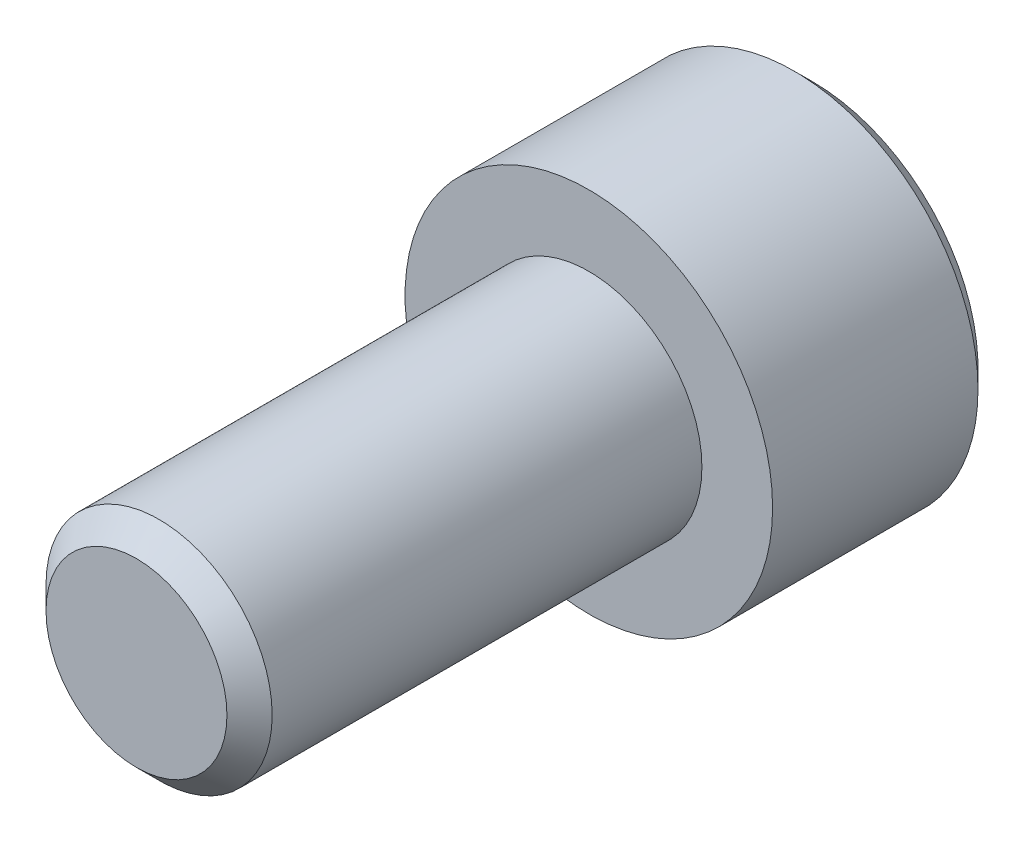
ISO-10303-21;
HEADER;
FILE_DESCRIPTION(('STEP AP214'),'2;1');
FILE_NAME('part.step','',(''),(''),'','','');
FILE_SCHEMA(('AUTOMOTIVE_DESIGN { 1 0 10303 214 1 1 1 1 }'));
ENDSEC;
DATA;
#1=APPLICATION_CONTEXT('core data for automotive mechanical design processes');
#2=APPLICATION_PROTOCOL_DEFINITION('international standard','automotive_design',2000,#1);
#3=PRODUCT_CONTEXT('',#1,'mechanical');
#4=PRODUCT('Part','Part','',(#3));
#5=PRODUCT_RELATED_PRODUCT_CATEGORY('part','',(#4));
#6=PRODUCT_DEFINITION_FORMATION('','',#4);
#7=PRODUCT_DEFINITION_CONTEXT('part definition',#1,'design');
#8=PRODUCT_DEFINITION('design','',#6,#7);
#9=PRODUCT_DEFINITION_SHAPE('','',#8);
#10=(LENGTH_UNIT() NAMED_UNIT(*) SI_UNIT(.MILLI.,.METRE.));
#11=(NAMED_UNIT(*) PLANE_ANGLE_UNIT() SI_UNIT($,.RADIAN.));
#12=(NAMED_UNIT(*) SI_UNIT($,.STERADIAN.) SOLID_ANGLE_UNIT());
#13=UNCERTAINTY_MEASURE_WITH_UNIT(LENGTH_MEASURE(1.E-05),#10,'distance_accuracy_value','');
#14=(GEOMETRIC_REPRESENTATION_CONTEXT(3) GLOBAL_UNCERTAINTY_ASSIGNED_CONTEXT((#13)) GLOBAL_UNIT_ASSIGNED_CONTEXT((#10,
#11,#12)) REPRESENTATION_CONTEXT('',''));
#15=CARTESIAN_POINT('',(0.,0.,0.));
#16=DIRECTION('',(0.,0.,1.));
#17=DIRECTION('',(1.,0.,0.));
#18=AXIS2_PLACEMENT_3D('',#15,#16,#17);
#19=CARTESIAN_POINT('',(0.,0.,-4.25));
#20=DIRECTION('',(0.,0.,1.));
#21=DIRECTION('',(1.,0.,0.));
#22=AXIS2_PLACEMENT_3D('',#19,#20,#21);
#23=PLANE('',#22);
#24=DIRECTION('',(0.866025403784439,0.499999999999999,0.));
#25=VECTOR('',#24,1.);
#26=CARTESIAN_POINT('',(3.,-1.73205080756888,-4.25));
#27=LINE('',#26,#25);
#28=CARTESIAN_POINT('',(3.,-1.73205080756888,-4.25));
#29=VERTEX_POINT('',#28);
#30=CARTESIAN_POINT('',(0.,-3.46410161513775,-4.25));
#31=VERTEX_POINT('',#30);
#32=EDGE_CURVE('E68',#29,#31,#27,.F.);
#33=ORIENTED_EDGE('',*,*,#32,.T.);
#34=DIRECTION('',(0.866025403784438,-0.5,0.));
#35=VECTOR('',#34,1.);
#36=CARTESIAN_POINT('',(0.,-3.46410161513775,-4.25));
#37=LINE('',#36,#35);
#38=CARTESIAN_POINT('',(-3.,-1.73205080756888,-4.25));
#39=VERTEX_POINT('',#38);
#40=EDGE_CURVE('E91',#31,#39,#37,.F.);
#41=ORIENTED_EDGE('',*,*,#40,.T.);
#42=DIRECTION('',(0.,1.,0.));
#43=VECTOR('',#42,1.);
#44=CARTESIAN_POINT('',(-3.,-1.73205080756888,-4.25));
#45=LINE('',#44,#43);
#46=CARTESIAN_POINT('',(-3.,1.73205080756888,-4.25));
#47=VERTEX_POINT('',#46);
#48=EDGE_CURVE('E131',#39,#47,#45,.T.);
#49=ORIENTED_EDGE('',*,*,#48,.T.);
#50=DIRECTION('',(-0.866025403784439,-0.5,0.));
#51=VECTOR('',#50,1.);
#52=CARTESIAN_POINT('',(-3.,1.73205080756888,-4.25));
#53=LINE('',#52,#51);
#54=CARTESIAN_POINT('',(0.,3.46410161513775,-4.25));
#55=VERTEX_POINT('',#54);
#56=EDGE_CURVE('E126',#47,#55,#53,.F.);
#57=ORIENTED_EDGE('',*,*,#56,.T.);
#58=DIRECTION('',(-0.866025403784439,0.5,0.));
#59=VECTOR('',#58,1.);
#60=CARTESIAN_POINT('',(0.,3.46410161513775,-4.25));
#61=LINE('',#60,#59);
#62=CARTESIAN_POINT('',(3.,1.73205080756888,-4.25));
#63=VERTEX_POINT('',#62);
#64=EDGE_CURVE('E74',#55,#63,#61,.F.);
#65=ORIENTED_EDGE('',*,*,#64,.T.);
#66=DIRECTION('',(0.,1.,0.));
#67=VECTOR('',#66,1.);
#68=CARTESIAN_POINT('',(3.,1.73205080756888,-4.25));
#69=LINE('',#68,#67);
#70=EDGE_CURVE('E71',#63,#29,#69,.F.);
#71=ORIENTED_EDGE('',*,*,#70,.T.);
#72=EDGE_LOOP('',(#33,#41,#49,#57,#65,#71));
#73=FACE_BOUND('',#72,.T.);
#74=ADVANCED_FACE('F17',(#73),#23,.F.);
#75=CARTESIAN_POINT('',(3.,1.73205080756888,-7.915));
#76=DIRECTION('',(1.,0.,0.));
#77=DIRECTION('',(0.,0.,-1.));
#78=AXIS2_PLACEMENT_3D('',#75,#76,#77);
#79=PLANE('',#78);
#80=DIRECTION('',(0.,0.,1.));
#81=VECTOR('',#80,1.);
#82=CARTESIAN_POINT('',(3.,1.73205080756887,-7.915));
#83=LINE('',#82,#81);
#84=CARTESIAN_POINT('',(3.,1.73205080756888,-7.915));
#85=VERTEX_POINT('',#84);
#86=EDGE_CURVE('E124',#63,#85,#83,.F.);
#87=ORIENTED_EDGE('',*,*,#86,.T.);
#88=DIRECTION('',(0.,1.,0.));
#89=VECTOR('',#88,1.);
#90=CARTESIAN_POINT('',(3.,0.,-7.915));
#91=LINE('',#90,#89);
#92=CARTESIAN_POINT('',(3.,-1.73205080756888,-7.915));
#93=VERTEX_POINT('',#92);
#94=EDGE_CURVE('E82',#85,#93,#91,.F.);
#95=ORIENTED_EDGE('',*,*,#94,.T.);
#96=DIRECTION('',(0.,0.,1.));
#97=VECTOR('',#96,1.);
#98=CARTESIAN_POINT('',(3.,-1.73205080756888,-7.915));
#99=LINE('',#98,#97);
#100=EDGE_CURVE('E77',#93,#29,#99,.T.);
#101=ORIENTED_EDGE('',*,*,#100,.T.);
#102=ORIENTED_EDGE('',*,*,#70,.F.);
#103=EDGE_LOOP('',(#87,#95,#101,#102));
#104=FACE_BOUND('',#103,.T.);
#105=ADVANCED_FACE('F80',(#104),#79,.F.);
#106=CARTESIAN_POINT('',(3.,-1.73205080756888,-7.915));
#107=DIRECTION('',(0.499999999999999,-0.866025403784439,0.));
#108=DIRECTION('',(0.866025403784439,0.499999999999999,0.));
#109=AXIS2_PLACEMENT_3D('',#106,#107,#108);
#110=PLANE('',#109);
#111=ORIENTED_EDGE('',*,*,#100,.F.);
#112=DIRECTION('',(-0.86602540378444,-0.499999999999998,0.));
#113=VECTOR('',#112,1.);
#114=CARTESIAN_POINT('',(3.,-1.73205080756888,-7.915));
#115=LINE('',#114,#113);
#116=CARTESIAN_POINT('',(0.,-3.46410161513775,-7.915));
#117=VERTEX_POINT('',#116);
#118=EDGE_CURVE('E118',#93,#117,#115,.T.);
#119=ORIENTED_EDGE('',*,*,#118,.T.);
#120=DIRECTION('',(0.,0.,1.));
#121=VECTOR('',#120,1.);
#122=CARTESIAN_POINT('',(0.,-3.46410161513775,-7.915));
#123=LINE('',#122,#121);
#124=EDGE_CURVE('E88',#117,#31,#123,.T.);
#125=ORIENTED_EDGE('',*,*,#124,.T.);
#126=ORIENTED_EDGE('',*,*,#32,.F.);
#127=EDGE_LOOP('',(#111,#119,#125,#126));
#128=FACE_BOUND('',#127,.T.);
#129=ADVANCED_FACE('F86',(#128),#110,.F.);
#130=CARTESIAN_POINT('',(0.,-3.46410161513775,-7.915));
#131=DIRECTION('',(-0.5,-0.866025403784438,0.));
#132=DIRECTION('',(0.866025403784438,-0.5,0.));
#133=AXIS2_PLACEMENT_3D('',#130,#131,#132);
#134=PLANE('',#133);
#135=ORIENTED_EDGE('',*,*,#124,.F.);
#136=DIRECTION('',(-0.866025403784439,0.499999999999999,0.));
#137=VECTOR('',#136,1.);
#138=CARTESIAN_POINT('',(0.,-3.46410161513775,-7.915));
#139=LINE('',#138,#137);
#140=CARTESIAN_POINT('',(-3.,-1.73205080756888,-7.915));
#141=VERTEX_POINT('',#140);
#142=EDGE_CURVE('E116',#117,#141,#139,.T.);
#143=ORIENTED_EDGE('',*,*,#142,.T.);
#144=DIRECTION('',(0.,0.,1.));
#145=VECTOR('',#144,1.);
#146=CARTESIAN_POINT('',(-3.,-1.73205080756888,-7.915));
#147=LINE('',#146,#145);
#148=EDGE_CURVE('E133',#141,#39,#147,.T.);
#149=ORIENTED_EDGE('',*,*,#148,.T.);
#150=ORIENTED_EDGE('',*,*,#40,.F.);
#151=EDGE_LOOP('',(#135,#143,#149,#150));
#152=FACE_BOUND('',#151,.T.);
#153=ADVANCED_FACE('F138',(#152),#134,.F.);
#154=CARTESIAN_POINT('',(-3.,-1.73205080756888,-7.915));
#155=DIRECTION('',(-1.,0.,0.));
#156=DIRECTION('',(0.,0.,1.));
#157=AXIS2_PLACEMENT_3D('',#154,#155,#156);
#158=PLANE('',#157);
#159=ORIENTED_EDGE('',*,*,#148,.F.);
#160=DIRECTION('',(0.,1.,0.));
#161=VECTOR('',#160,1.);
#162=CARTESIAN_POINT('',(-3.,0.,-7.915));
#163=LINE('',#162,#161);
#164=CARTESIAN_POINT('',(-3.,1.73205080756888,-7.915));
#165=VERTEX_POINT('',#164);
#166=EDGE_CURVE('E114',#141,#165,#163,.T.);
#167=ORIENTED_EDGE('',*,*,#166,.T.);
#168=DIRECTION('',(0.,0.,1.));
#169=VECTOR('',#168,1.);
#170=CARTESIAN_POINT('',(-3.,1.73205080756888,-7.915));
#171=LINE('',#170,#169);
#172=EDGE_CURVE('E128',#165,#47,#171,.T.);
#173=ORIENTED_EDGE('',*,*,#172,.T.);
#174=ORIENTED_EDGE('',*,*,#48,.F.);
#175=EDGE_LOOP('',(#159,#167,#173,#174));
#176=FACE_BOUND('',#175,.T.);
#177=ADVANCED_FACE('F142',(#176),#158,.F.);
#178=CARTESIAN_POINT('',(-3.,1.73205080756888,-7.915));
#179=DIRECTION('',(-0.5,0.866025403784439,0.));
#180=DIRECTION('',(-0.866025403784439,-0.5,0.));
#181=AXIS2_PLACEMENT_3D('',#178,#179,#180);
#182=PLANE('',#181);
#183=ORIENTED_EDGE('',*,*,#172,.F.);
#184=DIRECTION('',(0.86602540378444,0.499999999999998,0.));
#185=VECTOR('',#184,1.);
#186=CARTESIAN_POINT('',(-3.,1.73205080756888,-7.915));
#187=LINE('',#186,#185);
#188=CARTESIAN_POINT('',(0.,3.46410161513775,-7.915));
#189=VERTEX_POINT('',#188);
#190=EDGE_CURVE('E35',#165,#189,#187,.T.);
#191=ORIENTED_EDGE('',*,*,#190,.T.);
#192=DIRECTION('',(0.,0.,1.));
#193=VECTOR('',#192,1.);
#194=CARTESIAN_POINT('',(0.,3.46410161513775,-7.915));
#195=LINE('',#194,#193);
#196=EDGE_CURVE('E122',#189,#55,#195,.T.);
#197=ORIENTED_EDGE('',*,*,#196,.T.);
#198=ORIENTED_EDGE('',*,*,#56,.F.);
#199=EDGE_LOOP('',(#183,#191,#197,#198));
#200=FACE_BOUND('',#199,.T.);
#201=ADVANCED_FACE('F144',(#200),#182,.F.);
#202=CARTESIAN_POINT('',(0.,3.46410161513775,-7.915));
#203=DIRECTION('',(0.5,0.866025403784439,0.));
#204=DIRECTION('',(-0.866025403784439,0.5,0.));
#205=AXIS2_PLACEMENT_3D('',#202,#203,#204);
#206=PLANE('',#205);
#207=ORIENTED_EDGE('',*,*,#196,.F.);
#208=DIRECTION('',(0.86602540378444,-0.499999999999998,0.));
#209=VECTOR('',#208,1.);
#210=CARTESIAN_POINT('',(0.,3.46410161513775,-7.915));
#211=LINE('',#210,#209);
#212=EDGE_CURVE('E109',#189,#85,#211,.T.);
#213=ORIENTED_EDGE('',*,*,#212,.T.);
#214=ORIENTED_EDGE('',*,*,#86,.F.);
#215=ORIENTED_EDGE('',*,*,#64,.F.);
#216=EDGE_LOOP('',(#207,#213,#214,#215));
#217=FACE_BOUND('',#216,.T.);
#218=ADVANCED_FACE('F147',(#217),#206,.F.);
#219=CARTESIAN_POINT('',(0.,0.,-7.915));
#220=DIRECTION('',(0.,0.,1.));
#221=DIRECTION('',(1.,0.,0.));
#222=AXIS2_PLACEMENT_3D('',#219,#220,#221);
#223=PLANE('',#222);
#224=ORIENTED_EDGE('',*,*,#190,.F.);
#225=ORIENTED_EDGE('',*,*,#166,.F.);
#226=ORIENTED_EDGE('',*,*,#142,.F.);
#227=ORIENTED_EDGE('',*,*,#118,.F.);
#228=ORIENTED_EDGE('',*,*,#94,.F.);
#229=ORIENTED_EDGE('',*,*,#212,.F.);
#230=EDGE_LOOP('',(#224,#225,#226,#227,#228,#229));
#231=FACE_BOUND('',#230,.T.);
#232=CARTESIAN_POINT('',(0.,0.,-7.91499999996859));
#233=DIRECTION('',(0.,0.,1.));
#234=DIRECTION('',(0.,-1.,0.));
#235=AXIS2_PLACEMENT_3D('',#232,#233,#234);
#236=CIRCLE('',#235,5.85000000012315);
#237=CARTESIAN_POINT('',(0.,-5.85000000012315,-7.91499999996859));
#238=VERTEX_POINT('',#237);
#239=EDGE_CURVE('E20',#238,#238,#236,.T.);
#240=ORIENTED_EDGE('',*,*,#239,.F.);
#241=EDGE_LOOP('',(#240));
#242=FACE_BOUND('',#241,.T.);
#243=ADVANCED_FACE('F149',(#231,#242),#223,.F.);
#244=CARTESIAN_POINT('',(0.,0.,-7.26500000013175));
#245=DIRECTION('',(0.,0.,1.));
#246=DIRECTION('',(0.,-1.,0.));
#247=AXIS2_PLACEMENT_3D('',#244,#245,#246);
#248=CONICAL_SURFACE('',#247,6.49999999995998,0.785398163397448);
#249=ORIENTED_EDGE('',*,*,#239,.T.);
#250=EDGE_LOOP('',(#249));
#251=FACE_BOUND('',#250,.T.);
#252=CARTESIAN_POINT('',(0.,0.,-7.265));
#253=DIRECTION('',(0.,0.,1.));
#254=DIRECTION('',(1.,0.,0.));
#255=AXIS2_PLACEMENT_3D('',#252,#253,#254);
#256=CIRCLE('',#255,6.5);
#257=CARTESIAN_POINT('',(6.5,0.,-7.265));
#258=VERTEX_POINT('',#257);
#259=EDGE_CURVE('E101',#258,#258,#256,.T.);
#260=ORIENTED_EDGE('',*,*,#259,.F.);
#261=EDGE_LOOP('',(#260));
#262=FACE_BOUND('',#261,.T.);
#263=ADVANCED_FACE('F152',(#251,#262),#248,.T.);
#264=CARTESIAN_POINT('',(0.,0.,-7.915));
#265=DIRECTION('',(0.,0.,1.));
#266=DIRECTION('',(1.,0.,0.));
#267=AXIS2_PLACEMENT_3D('',#264,#265,#266);
#268=CYLINDRICAL_SURFACE('',#267,6.5);
#269=ORIENTED_EDGE('',*,*,#259,.T.);
#270=EDGE_LOOP('',(#269));
#271=FACE_BOUND('',#270,.T.);
#272=CARTESIAN_POINT('',(0.,0.,0.));
#273=DIRECTION('',(0.,0.,1.));
#274=DIRECTION('',(1.,0.,0.));
#275=AXIS2_PLACEMENT_3D('',#272,#273,#274);
#276=CIRCLE('',#275,6.5);
#277=CARTESIAN_POINT('',(6.5,0.,0.));
#278=VERTEX_POINT('',#277);
#279=EDGE_CURVE('E99',#278,#278,#276,.T.);
#280=ORIENTED_EDGE('',*,*,#279,.F.);
#281=EDGE_LOOP('',(#280));
#282=FACE_BOUND('',#281,.T.);
#283=ADVANCED_FACE('F158',(#271,#282),#268,.T.);
#284=CARTESIAN_POINT('',(0.,0.,16.));
#285=DIRECTION('',(0.,0.,1.));
#286=DIRECTION('',(1.,0.,0.));
#287=AXIS2_PLACEMENT_3D('',#284,#285,#286);
#288=PLANE('',#287);
#289=CARTESIAN_POINT('',(0.,0.,15.9999999999059));
#290=DIRECTION('',(0.,0.,-1.));
#291=DIRECTION('',(-1.,0.,0.));
#292=AXIS2_PLACEMENT_3D('',#289,#290,#291);
#293=CIRCLE('',#292,3.20000000004939);
#294=CARTESIAN_POINT('',(-3.20000000004939,0.,15.9999999999059));
#295=VERTEX_POINT('',#294);
#296=EDGE_CURVE('E97',#295,#295,#293,.T.);
#297=ORIENTED_EDGE('',*,*,#296,.F.);
#298=EDGE_LOOP('',(#297));
#299=FACE_BOUND('',#298,.T.);
#300=ADVANCED_FACE('F164',(#299),#288,.T.);
#301=CARTESIAN_POINT('',(0.,0.,0.));
#302=DIRECTION('',(0.,0.,1.));
#303=DIRECTION('',(1.,0.,0.));
#304=AXIS2_PLACEMENT_3D('',#301,#302,#303);
#305=PLANE('',#304);
#306=ORIENTED_EDGE('',*,*,#279,.T.);
#307=EDGE_LOOP('',(#306));
#308=FACE_BOUND('',#307,.T.);
#309=CARTESIAN_POINT('',(0.,0.,0.));
#310=DIRECTION('',(0.,0.,1.));
#311=DIRECTION('',(1.,0.,0.));
#312=AXIS2_PLACEMENT_3D('',#309,#310,#311);
#313=CIRCLE('',#312,4.);
#314=CARTESIAN_POINT('',(4.,0.,0.));
#315=VERTEX_POINT('',#314);
#316=EDGE_CURVE('E26',#315,#315,#313,.T.);
#317=ORIENTED_EDGE('',*,*,#316,.F.);
#318=EDGE_LOOP('',(#317));
#319=FACE_BOUND('',#318,.T.);
#320=ADVANCED_FACE('F174',(#308,#319),#305,.T.);
#321=CARTESIAN_POINT('',(0.,0.,15.2000000000498));
#322=DIRECTION('',(0.,0.,-1.));
#323=DIRECTION('',(-1.,0.,0.));
#324=AXIS2_PLACEMENT_3D('',#321,#322,#323);
#325=CONICAL_SURFACE('',#324,3.99999999990541,0.785398163397448);
#326=CARTESIAN_POINT('',(0.,0.,15.2));
#327=DIRECTION('',(0.,0.,1.));
#328=DIRECTION('',(1.,0.,0.));
#329=AXIS2_PLACEMENT_3D('',#326,#327,#328);
#330=CIRCLE('',#329,4.);
#331=CARTESIAN_POINT('',(4.,0.,15.2));
#332=VERTEX_POINT('',#331);
#333=EDGE_CURVE('E11',#332,#332,#330,.F.);
#334=ORIENTED_EDGE('',*,*,#333,.F.);
#335=EDGE_LOOP('',(#334));
#336=FACE_BOUND('',#335,.T.);
#337=ORIENTED_EDGE('',*,*,#296,.T.);
#338=EDGE_LOOP('',(#337));
#339=FACE_BOUND('',#338,.T.);
#340=ADVANCED_FACE('F168',(#336,#339),#325,.T.);
#341=CARTESIAN_POINT('',(0.,0.,-4.25));
#342=DIRECTION('',(0.,0.,1.));
#343=DIRECTION('',(1.,0.,0.));
#344=AXIS2_PLACEMENT_3D('',#341,#342,#343);
#345=CYLINDRICAL_SURFACE('',#344,4.);
#346=ORIENTED_EDGE('',*,*,#333,.T.);
#347=EDGE_LOOP('',(#346));
#348=FACE_BOUND('',#347,.T.);
#349=ORIENTED_EDGE('',*,*,#316,.T.);
#350=EDGE_LOOP('',(#349));
#351=FACE_BOUND('',#350,.T.);
#352=ADVANCED_FACE('F166',(#348,#351),#345,.T.);
#353=CLOSED_SHELL('',(#74,#105,#129,#153,#177,#201,#218,#243,#263,#283,#300,#320,#340,#352));
#354=MANIFOLD_SOLID_BREP('B1',#353);
#355=ADVANCED_BREP_SHAPE_REPRESENTATION('',(#18,#354),#14);
#356=SHAPE_DEFINITION_REPRESENTATION(#9,#355);
ENDSEC;
END-ISO-10303-21;
